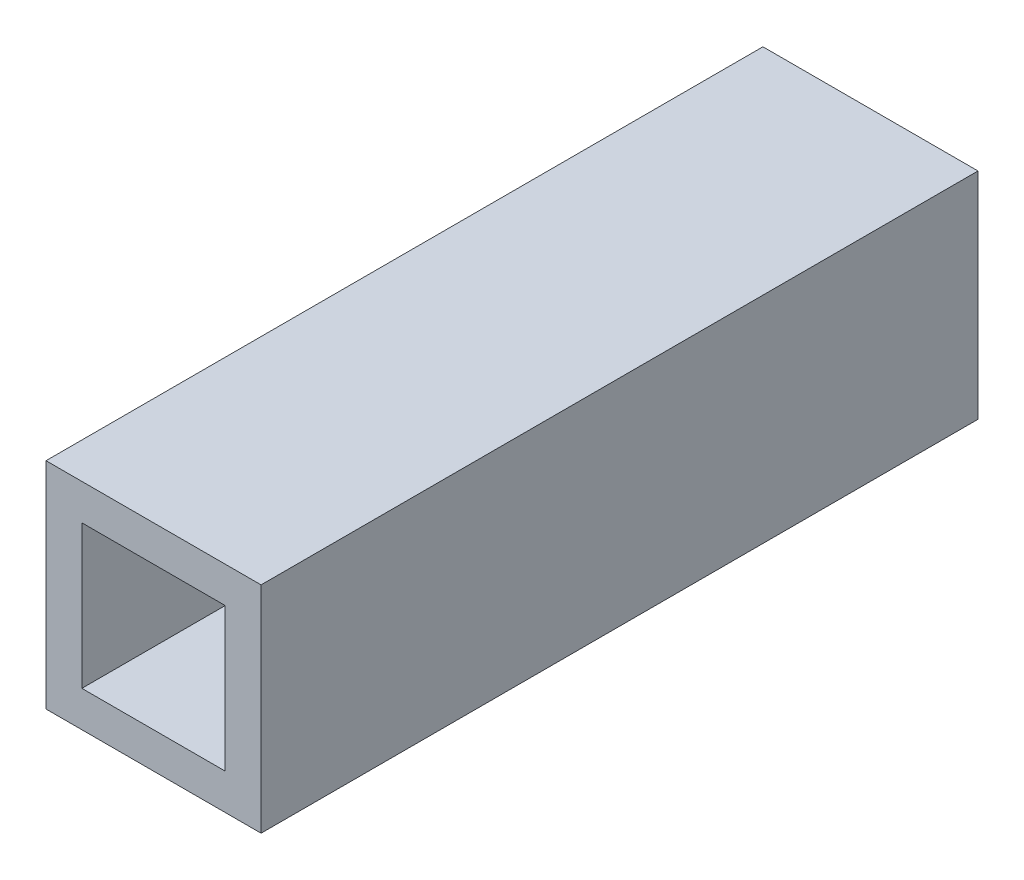
ISO-10303-21;
HEADER;
FILE_DESCRIPTION(('STEP AP214'),'2;1');
FILE_NAME('part.step','',(''),(''),'','','');
FILE_SCHEMA(('AUTOMOTIVE_DESIGN { 1 0 10303 214 1 1 1 1 }'));
ENDSEC;
DATA;
#1=APPLICATION_CONTEXT('core data for automotive mechanical design processes');
#2=APPLICATION_PROTOCOL_DEFINITION('international standard','automotive_design',2000,#1);
#3=PRODUCT_CONTEXT('',#1,'mechanical');
#4=PRODUCT('Part','Part','',(#3));
#5=PRODUCT_RELATED_PRODUCT_CATEGORY('part','',(#4));
#6=PRODUCT_DEFINITION_FORMATION('','',#4);
#7=PRODUCT_DEFINITION_CONTEXT('part definition',#1,'design');
#8=PRODUCT_DEFINITION('design','',#6,#7);
#9=PRODUCT_DEFINITION_SHAPE('','',#8);
#10=(LENGTH_UNIT() NAMED_UNIT(*) SI_UNIT(.MILLI.,.METRE.));
#11=(NAMED_UNIT(*) PLANE_ANGLE_UNIT() SI_UNIT($,.RADIAN.));
#12=(NAMED_UNIT(*) SI_UNIT($,.STERADIAN.) SOLID_ANGLE_UNIT());
#13=UNCERTAINTY_MEASURE_WITH_UNIT(LENGTH_MEASURE(1.E-05),#10,'distance_accuracy_value','');
#14=(GEOMETRIC_REPRESENTATION_CONTEXT(3) GLOBAL_UNCERTAINTY_ASSIGNED_CONTEXT((#13)) GLOBAL_UNIT_ASSIGNED_CONTEXT((#10,
#11,#12)) REPRESENTATION_CONTEXT('',''));
#15=CARTESIAN_POINT('',(0.,0.,0.));
#16=DIRECTION('',(0.,0.,1.));
#17=DIRECTION('',(1.,0.,0.));
#18=AXIS2_PLACEMENT_3D('',#15,#16,#17);
#19=CARTESIAN_POINT('',(15.,15.,-9.99999999994061E-05));
#20=DIRECTION('',(1.,0.,0.));
#21=DIRECTION('',(0.,0.,-1.));
#22=AXIS2_PLACEMENT_3D('',#19,#20,#21);
#23=PLANE('',#22);
#24=DIRECTION('',(0.,0.,1.));
#25=VECTOR('',#24,1.);
#26=CARTESIAN_POINT('',(15.,15.,-9.99999999994061E-05));
#27=LINE('',#26,#25);
#28=CARTESIAN_POINT('',(15.,15.,-9.99999999994061E-05));
#29=VERTEX_POINT('',#28);
#30=CARTESIAN_POINT('',(15.,15.,100.));
#31=VERTEX_POINT('',#30);
#32=EDGE_CURVE('E38',#29,#31,#27,.T.);
#33=ORIENTED_EDGE('',*,*,#32,.T.);
#34=DIRECTION('',(0.,1.,0.));
#35=VECTOR('',#34,1.);
#36=CARTESIAN_POINT('',(15.,15.,100.));
#37=LINE('',#36,#35);
#38=CARTESIAN_POINT('',(15.,-15.,100.));
#39=VERTEX_POINT('',#38);
#40=EDGE_CURVE('E130',#39,#31,#37,.T.);
#41=ORIENTED_EDGE('',*,*,#40,.F.);
#42=DIRECTION('',(0.,0.,1.));
#43=VECTOR('',#42,1.);
#44=CARTESIAN_POINT('',(15.,-15.,-9.99999999994061E-05));
#45=LINE('',#44,#43);
#46=CARTESIAN_POINT('',(15.,-15.,-9.99999999994061E-05));
#47=VERTEX_POINT('',#46);
#48=EDGE_CURVE('E11',#47,#39,#45,.T.);
#49=ORIENTED_EDGE('',*,*,#48,.F.);
#50=DIRECTION('',(0.,1.,0.));
#51=VECTOR('',#50,1.);
#52=CARTESIAN_POINT('',(15.,15.,-9.99999999994061E-05));
#53=LINE('',#52,#51);
#54=EDGE_CURVE('E149',#47,#29,#53,.T.);
#55=ORIENTED_EDGE('',*,*,#54,.T.);
#56=EDGE_LOOP('',(#33,#41,#49,#55));
#57=FACE_BOUND('',#56,.T.);
#58=ADVANCED_FACE('F35',(#57),#23,.T.);
#59=CARTESIAN_POINT('',(-15.,-15.,-9.99999999994061E-05));
#60=DIRECTION('',(0.,-1.,0.));
#61=DIRECTION('',(0.,0.,-1.));
#62=AXIS2_PLACEMENT_3D('',#59,#60,#61);
#63=PLANE('',#62);
#64=ORIENTED_EDGE('',*,*,#48,.T.);
#65=DIRECTION('',(1.,0.,0.));
#66=VECTOR('',#65,1.);
#67=CARTESIAN_POINT('',(-15.,-15.,100.));
#68=LINE('',#67,#66);
#69=CARTESIAN_POINT('',(-15.,-15.,100.));
#70=VERTEX_POINT('',#69);
#71=EDGE_CURVE('E139',#70,#39,#68,.T.);
#72=ORIENTED_EDGE('',*,*,#71,.F.);
#73=DIRECTION('',(0.,0.,1.));
#74=VECTOR('',#73,1.);
#75=CARTESIAN_POINT('',(-15.,-15.,-9.99999999994061E-05));
#76=LINE('',#75,#74);
#77=CARTESIAN_POINT('',(-15.,-15.,-9.99999999994061E-05));
#78=VERTEX_POINT('',#77);
#79=EDGE_CURVE('E43',#78,#70,#76,.T.);
#80=ORIENTED_EDGE('',*,*,#79,.F.);
#81=DIRECTION('',(1.,0.,0.));
#82=VECTOR('',#81,1.);
#83=CARTESIAN_POINT('',(-15.,-15.,-9.99999999994061E-05));
#84=LINE('',#83,#82);
#85=EDGE_CURVE('E160',#78,#47,#84,.T.);
#86=ORIENTED_EDGE('',*,*,#85,.T.);
#87=EDGE_LOOP('',(#64,#72,#80,#86));
#88=FACE_BOUND('',#87,.T.);
#89=ADVANCED_FACE('F172',(#88),#63,.T.);
#90=CARTESIAN_POINT('',(-15.,15.,-9.99999999994061E-05));
#91=DIRECTION('',(-1.,0.,0.));
#92=DIRECTION('',(0.,0.,1.));
#93=AXIS2_PLACEMENT_3D('',#90,#91,#92);
#94=PLANE('',#93);
#95=ORIENTED_EDGE('',*,*,#79,.T.);
#96=DIRECTION('',(0.,-1.,0.));
#97=VECTOR('',#96,1.);
#98=CARTESIAN_POINT('',(-15.,15.,100.));
#99=LINE('',#98,#97);
#100=CARTESIAN_POINT('',(-15.,15.,100.));
#101=VERTEX_POINT('',#100);
#102=EDGE_CURVE('E136',#101,#70,#99,.T.);
#103=ORIENTED_EDGE('',*,*,#102,.F.);
#104=DIRECTION('',(0.,0.,1.));
#105=VECTOR('',#104,1.);
#106=CARTESIAN_POINT('',(-15.,15.,-9.99999999994061E-05));
#107=LINE('',#106,#105);
#108=CARTESIAN_POINT('',(-15.,15.,-9.99999999994061E-05));
#109=VERTEX_POINT('',#108);
#110=EDGE_CURVE('E163',#109,#101,#107,.T.);
#111=ORIENTED_EDGE('',*,*,#110,.F.);
#112=DIRECTION('',(0.,-1.,0.));
#113=VECTOR('',#112,1.);
#114=CARTESIAN_POINT('',(-15.,15.,-9.99999999994061E-05));
#115=LINE('',#114,#113);
#116=EDGE_CURVE('E157',#109,#78,#115,.T.);
#117=ORIENTED_EDGE('',*,*,#116,.T.);
#118=EDGE_LOOP('',(#95,#103,#111,#117));
#119=FACE_BOUND('',#118,.T.);
#120=ADVANCED_FACE('F178',(#119),#94,.T.);
#121=CARTESIAN_POINT('',(-15.,15.,-9.99999999994061E-05));
#122=DIRECTION('',(0.,1.,0.));
#123=DIRECTION('',(0.,0.,1.));
#124=AXIS2_PLACEMENT_3D('',#121,#122,#123);
#125=PLANE('',#124);
#126=ORIENTED_EDGE('',*,*,#110,.T.);
#127=DIRECTION('',(-1.,0.,0.));
#128=VECTOR('',#127,1.);
#129=CARTESIAN_POINT('',(-15.,15.,100.));
#130=LINE('',#129,#128);
#131=EDGE_CURVE('E133',#31,#101,#130,.T.);
#132=ORIENTED_EDGE('',*,*,#131,.F.);
#133=ORIENTED_EDGE('',*,*,#32,.F.);
#134=DIRECTION('',(-1.,0.,0.));
#135=VECTOR('',#134,1.);
#136=CARTESIAN_POINT('',(-15.,15.,-9.99999999994061E-05));
#137=LINE('',#136,#135);
#138=EDGE_CURVE('E154',#29,#109,#137,.T.);
#139=ORIENTED_EDGE('',*,*,#138,.T.);
#140=EDGE_LOOP('',(#126,#132,#133,#139));
#141=FACE_BOUND('',#140,.T.);
#142=ADVANCED_FACE('F167',(#141),#125,.T.);
#143=CARTESIAN_POINT('',(0.,0.,-9.99999999994061E-05));
#144=DIRECTION('',(0.,0.,1.));
#145=DIRECTION('',(1.,0.,0.));
#146=AXIS2_PLACEMENT_3D('',#143,#144,#145);
#147=PLANE('',#146);
#148=DIRECTION('',(1.,0.,0.));
#149=VECTOR('',#148,1.);
#150=CARTESIAN_POINT('',(-10.,-10.,-9.99999999994061E-05));
#151=LINE('',#150,#149);
#152=CARTESIAN_POINT('',(-10.,-10.,-9.99999999994061E-05));
#153=VERTEX_POINT('',#152);
#154=CARTESIAN_POINT('',(9.99999999999999,-10.,-9.99999999994061E-05));
#155=VERTEX_POINT('',#154);
#156=EDGE_CURVE('E112',#153,#155,#151,.T.);
#157=ORIENTED_EDGE('',*,*,#156,.T.);
#158=DIRECTION('',(0.,1.,0.));
#159=VECTOR('',#158,1.);
#160=CARTESIAN_POINT('',(9.99999999999999,9.99999999999999,-9.99999999994061E-05));
#161=LINE('',#160,#159);
#162=CARTESIAN_POINT('',(9.99999999999999,9.99999999999999,-9.99999999994061E-05));
#163=VERTEX_POINT('',#162);
#164=EDGE_CURVE('E142',#155,#163,#161,.T.);
#165=ORIENTED_EDGE('',*,*,#164,.T.);
#166=DIRECTION('',(-1.,0.,0.));
#167=VECTOR('',#166,1.);
#168=CARTESIAN_POINT('',(-10.,9.99999999999999,-9.99999999994061E-05));
#169=LINE('',#168,#167);
#170=CARTESIAN_POINT('',(-10.,9.99999999999999,-9.99999999994061E-05));
#171=VERTEX_POINT('',#170);
#172=EDGE_CURVE('E107',#163,#171,#169,.T.);
#173=ORIENTED_EDGE('',*,*,#172,.T.);
#174=DIRECTION('',(0.,-1.,0.));
#175=VECTOR('',#174,1.);
#176=CARTESIAN_POINT('',(-10.,9.99999999999999,-9.99999999994061E-05));
#177=LINE('',#176,#175);
#178=EDGE_CURVE('E51',#171,#153,#177,.T.);
#179=ORIENTED_EDGE('',*,*,#178,.T.);
#180=EDGE_LOOP('',(#157,#165,#173,#179));
#181=FACE_BOUND('',#180,.T.);
#182=ORIENTED_EDGE('',*,*,#54,.F.);
#183=ORIENTED_EDGE('',*,*,#85,.F.);
#184=ORIENTED_EDGE('',*,*,#116,.F.);
#185=ORIENTED_EDGE('',*,*,#138,.F.);
#186=EDGE_LOOP('',(#182,#183,#184,#185));
#187=FACE_BOUND('',#186,.T.);
#188=ADVANCED_FACE('F176',(#181,#187),#147,.F.);
#189=CARTESIAN_POINT('',(9.99999999999999,9.99999999999999,-9.99999999994061E-05));
#190=DIRECTION('',(1.,0.,0.));
#191=DIRECTION('',(0.,0.,-1.));
#192=AXIS2_PLACEMENT_3D('',#189,#190,#191);
#193=PLANE('',#192);
#194=DIRECTION('',(0.,0.,1.));
#195=VECTOR('',#194,1.);
#196=CARTESIAN_POINT('',(9.99999999999999,-10.,-9.99999999994061E-05));
#197=LINE('',#196,#195);
#198=CARTESIAN_POINT('',(9.99999999999999,-10.,100.));
#199=VERTEX_POINT('',#198);
#200=EDGE_CURVE('E117',#155,#199,#197,.T.);
#201=ORIENTED_EDGE('',*,*,#200,.T.);
#202=DIRECTION('',(0.,1.,0.));
#203=VECTOR('',#202,1.);
#204=CARTESIAN_POINT('',(9.99999999999999,9.99999999999999,100.));
#205=LINE('',#204,#203);
#206=CARTESIAN_POINT('',(9.99999999999999,9.99999999999999,100.));
#207=VERTEX_POINT('',#206);
#208=EDGE_CURVE('E115',#199,#207,#205,.T.);
#209=ORIENTED_EDGE('',*,*,#208,.T.);
#210=DIRECTION('',(0.,0.,1.));
#211=VECTOR('',#210,1.);
#212=CARTESIAN_POINT('',(9.99999999999999,9.99999999999999,-9.99999999994061E-05));
#213=LINE('',#212,#211);
#214=EDGE_CURVE('E100',#163,#207,#213,.T.);
#215=ORIENTED_EDGE('',*,*,#214,.F.);
#216=ORIENTED_EDGE('',*,*,#164,.F.);
#217=EDGE_LOOP('',(#201,#209,#215,#216));
#218=FACE_BOUND('',#217,.T.);
#219=ADVANCED_FACE('F116',(#218),#193,.F.);
#220=CARTESIAN_POINT('',(-10.,-10.,-9.99999999994061E-05));
#221=DIRECTION('',(0.,-1.,0.));
#222=DIRECTION('',(0.,0.,-1.));
#223=AXIS2_PLACEMENT_3D('',#220,#221,#222);
#224=PLANE('',#223);
#225=DIRECTION('',(0.,0.,1.));
#226=VECTOR('',#225,1.);
#227=CARTESIAN_POINT('',(-10.,-10.,-9.99999999994061E-05));
#228=LINE('',#227,#226);
#229=CARTESIAN_POINT('',(-10.,-10.,100.));
#230=VERTEX_POINT('',#229);
#231=EDGE_CURVE('E150',#153,#230,#228,.T.);
#232=ORIENTED_EDGE('',*,*,#231,.T.);
#233=DIRECTION('',(1.,0.,0.));
#234=VECTOR('',#233,1.);
#235=CARTESIAN_POINT('',(-10.,-10.,100.));
#236=LINE('',#235,#234);
#237=EDGE_CURVE('E126',#230,#199,#236,.T.);
#238=ORIENTED_EDGE('',*,*,#237,.T.);
#239=ORIENTED_EDGE('',*,*,#200,.F.);
#240=ORIENTED_EDGE('',*,*,#156,.F.);
#241=EDGE_LOOP('',(#232,#238,#239,#240));
#242=FACE_BOUND('',#241,.T.);
#243=ADVANCED_FACE('F221',(#242),#224,.F.);
#244=CARTESIAN_POINT('',(-10.,9.99999999999999,-9.99999999994061E-05));
#245=DIRECTION('',(-1.,0.,0.));
#246=DIRECTION('',(0.,0.,1.));
#247=AXIS2_PLACEMENT_3D('',#244,#245,#246);
#248=PLANE('',#247);
#249=DIRECTION('',(0.,0.,1.));
#250=VECTOR('',#249,1.);
#251=CARTESIAN_POINT('',(-10.,9.99999999999999,-9.99999999994061E-05));
#252=LINE('',#251,#250);
#253=CARTESIAN_POINT('',(-10.,9.99999999999999,100.));
#254=VERTEX_POINT('',#253);
#255=EDGE_CURVE('E111',#171,#254,#252,.T.);
#256=ORIENTED_EDGE('',*,*,#255,.T.);
#257=DIRECTION('',(0.,-1.,0.));
#258=VECTOR('',#257,1.);
#259=CARTESIAN_POINT('',(-10.,9.99999999999999,100.));
#260=LINE('',#259,#258);
#261=EDGE_CURVE('E124',#254,#230,#260,.T.);
#262=ORIENTED_EDGE('',*,*,#261,.T.);
#263=ORIENTED_EDGE('',*,*,#231,.F.);
#264=ORIENTED_EDGE('',*,*,#178,.F.);
#265=EDGE_LOOP('',(#256,#262,#263,#264));
#266=FACE_BOUND('',#265,.T.);
#267=ADVANCED_FACE('F230',(#266),#248,.F.);
#268=CARTESIAN_POINT('',(-10.,9.99999999999999,-9.99999999994061E-05));
#269=DIRECTION('',(0.,1.,0.));
#270=DIRECTION('',(0.,0.,1.));
#271=AXIS2_PLACEMENT_3D('',#268,#269,#270);
#272=PLANE('',#271);
#273=ORIENTED_EDGE('',*,*,#214,.T.);
#274=DIRECTION('',(-1.,0.,0.));
#275=VECTOR('',#274,1.);
#276=CARTESIAN_POINT('',(-10.,9.99999999999999,100.));
#277=LINE('',#276,#275);
#278=EDGE_CURVE('E104',#207,#254,#277,.T.);
#279=ORIENTED_EDGE('',*,*,#278,.T.);
#280=ORIENTED_EDGE('',*,*,#255,.F.);
#281=ORIENTED_EDGE('',*,*,#172,.F.);
#282=EDGE_LOOP('',(#273,#279,#280,#281));
#283=FACE_BOUND('',#282,.T.);
#284=ADVANCED_FACE('F102',(#283),#272,.F.);
#285=CARTESIAN_POINT('',(0.,0.,100.));
#286=DIRECTION('',(0.,0.,1.));
#287=DIRECTION('',(1.,0.,0.));
#288=AXIS2_PLACEMENT_3D('',#285,#286,#287);
#289=PLANE('',#288);
#290=ORIENTED_EDGE('',*,*,#40,.T.);
#291=ORIENTED_EDGE('',*,*,#131,.T.);
#292=ORIENTED_EDGE('',*,*,#102,.T.);
#293=ORIENTED_EDGE('',*,*,#71,.T.);
#294=EDGE_LOOP('',(#290,#291,#292,#293));
#295=FACE_BOUND('',#294,.T.);
#296=ORIENTED_EDGE('',*,*,#278,.F.);
#297=ORIENTED_EDGE('',*,*,#208,.F.);
#298=ORIENTED_EDGE('',*,*,#237,.F.);
#299=ORIENTED_EDGE('',*,*,#261,.F.);
#300=EDGE_LOOP('',(#296,#297,#298,#299));
#301=FACE_BOUND('',#300,.T.);
#302=ADVANCED_FACE('F122',(#295,#301),#289,.T.);
#303=CLOSED_SHELL('',(#58,#89,#120,#142,#188,#219,#243,#267,#284,#302));
#304=MANIFOLD_SOLID_BREP('B2',#303);
#305=ADVANCED_BREP_SHAPE_REPRESENTATION('',(#18,#304),#14);
#306=SHAPE_DEFINITION_REPRESENTATION(#9,#305);
ENDSEC;
END-ISO-10303-21;
